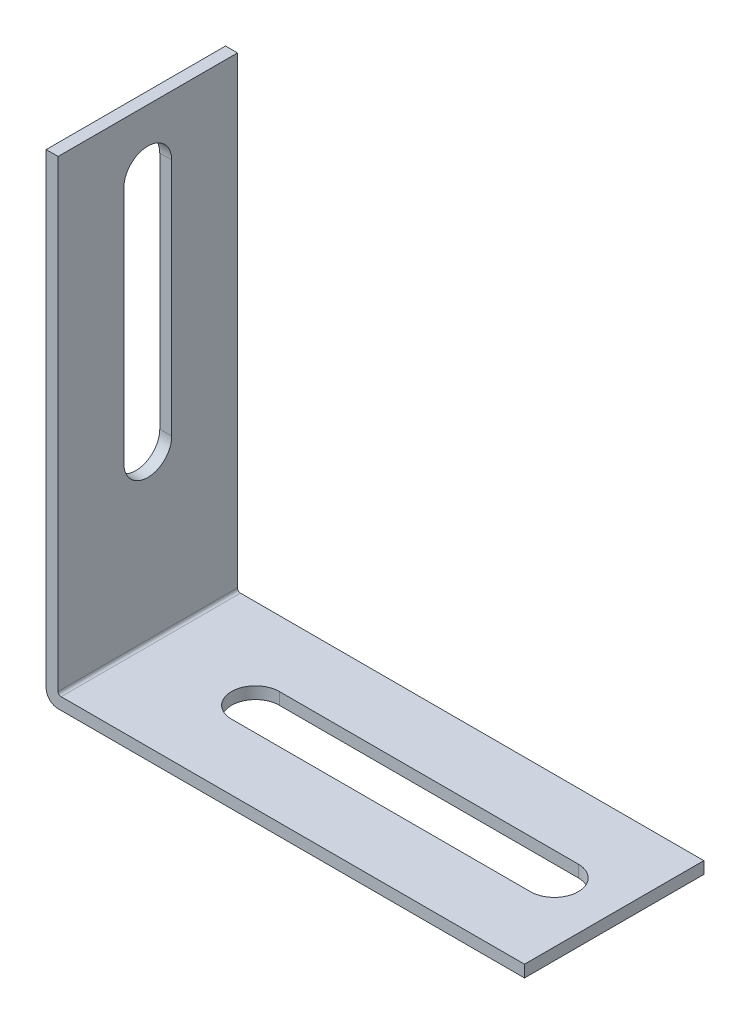
ISO-10303-21;
HEADER;
FILE_DESCRIPTION(('STEP AP214'),'2;1');
FILE_NAME('part.step','',(''),(''),'','','');
FILE_SCHEMA(('AUTOMOTIVE_DESIGN { 1 0 10303 214 1 1 1 1 }'));
ENDSEC;
DATA;
#1=APPLICATION_CONTEXT('core data for automotive mechanical design processes');
#2=APPLICATION_PROTOCOL_DEFINITION('international standard','automotive_design',2000,#1);
#3=PRODUCT_CONTEXT('',#1,'mechanical');
#4=PRODUCT('Part','Part','',(#3));
#5=PRODUCT_RELATED_PRODUCT_CATEGORY('part','',(#4));
#6=PRODUCT_DEFINITION_FORMATION('','',#4);
#7=PRODUCT_DEFINITION_CONTEXT('part definition',#1,'design');
#8=PRODUCT_DEFINITION('design','',#6,#7);
#9=PRODUCT_DEFINITION_SHAPE('','',#8);
#10=(LENGTH_UNIT() NAMED_UNIT(*) SI_UNIT(.MILLI.,.METRE.));
#11=(NAMED_UNIT(*) PLANE_ANGLE_UNIT() SI_UNIT($,.RADIAN.));
#12=(NAMED_UNIT(*) SI_UNIT($,.STERADIAN.) SOLID_ANGLE_UNIT());
#13=UNCERTAINTY_MEASURE_WITH_UNIT(LENGTH_MEASURE(1.E-05),#10,'distance_accuracy_value','');
#14=(GEOMETRIC_REPRESENTATION_CONTEXT(3) GLOBAL_UNCERTAINTY_ASSIGNED_CONTEXT((#13)) GLOBAL_UNIT_ASSIGNED_CONTEXT((#10,
#11,#12)) REPRESENTATION_CONTEXT('',''));
#15=CARTESIAN_POINT('',(0.,0.,0.));
#16=DIRECTION('',(0.,0.,1.));
#17=DIRECTION('',(1.,0.,0.));
#18=AXIS2_PLACEMENT_3D('',#15,#16,#17);
#19=CARTESIAN_POINT('',(2.,80.,30.));
#20=DIRECTION('',(0.,-1.,0.));
#21=DIRECTION('',(0.,0.,-1.));
#22=AXIS2_PLACEMENT_3D('',#19,#20,#21);
#23=PLANE('',#22);
#24=DIRECTION('',(-1.,0.,0.));
#25=VECTOR('',#24,1.);
#26=CARTESIAN_POINT('',(2.,80.,0.));
#27=LINE('',#26,#25);
#28=CARTESIAN_POINT('',(2.,80.,0.));
#29=VERTEX_POINT('',#28);
#30=CARTESIAN_POINT('',(0.,80.,0.));
#31=VERTEX_POINT('',#30);
#32=EDGE_CURVE('E214',#29,#31,#27,.T.);
#33=ORIENTED_EDGE('',*,*,#32,.T.);
#34=DIRECTION('',(0.,0.,-1.));
#35=VECTOR('',#34,1.);
#36=CARTESIAN_POINT('',(0.,80.,30.));
#37=LINE('',#36,#35);
#38=CARTESIAN_POINT('',(0.,80.,30.));
#39=VERTEX_POINT('',#38);
#40=EDGE_CURVE('E11',#39,#31,#37,.T.);
#41=ORIENTED_EDGE('',*,*,#40,.F.);
#42=DIRECTION('',(-1.,0.,0.));
#43=VECTOR('',#42,1.);
#44=CARTESIAN_POINT('',(2.,80.,30.));
#45=LINE('',#44,#43);
#46=CARTESIAN_POINT('',(2.,80.,30.));
#47=VERTEX_POINT('',#46);
#48=EDGE_CURVE('E215',#47,#39,#45,.T.);
#49=ORIENTED_EDGE('',*,*,#48,.F.);
#50=DIRECTION('',(0.,0.,-1.));
#51=VECTOR('',#50,1.);
#52=CARTESIAN_POINT('',(2.,80.,30.));
#53=LINE('',#52,#51);
#54=EDGE_CURVE('E233',#47,#29,#53,.T.);
#55=ORIENTED_EDGE('',*,*,#54,.T.);
#56=EDGE_LOOP('',(#33,#41,#49,#55));
#57=FACE_BOUND('',#56,.T.);
#58=ADVANCED_FACE('F35',(#57),#23,.F.);
#59=CARTESIAN_POINT('',(0.,80.,30.));
#60=DIRECTION('',(1.,0.,0.));
#61=DIRECTION('',(0.,1.,0.));
#62=AXIS2_PLACEMENT_3D('',#59,#60,#61);
#63=PLANE('',#62);
#64=DIRECTION('',(0.,-1.,0.));
#65=VECTOR('',#64,1.);
#66=CARTESIAN_POINT('',(0.,70.,11.));
#67=LINE('',#66,#65);
#68=CARTESIAN_POINT('',(0.,70.,11.));
#69=VERTEX_POINT('',#68);
#70=CARTESIAN_POINT('',(0.,30.,11.));
#71=VERTEX_POINT('',#70);
#72=EDGE_CURVE('E167',#69,#71,#67,.T.);
#73=ORIENTED_EDGE('',*,*,#72,.F.);
#74=CARTESIAN_POINT('',(0.,70.,15.));
#75=DIRECTION('',(1.,0.,0.));
#76=DIRECTION('',(0.,1.,0.));
#77=AXIS2_PLACEMENT_3D('',#74,#75,#76);
#78=CIRCLE('',#77,4.);
#79=CARTESIAN_POINT('',(0.,70.,19.));
#80=VERTEX_POINT('',#79);
#81=EDGE_CURVE('E149',#80,#69,#78,.F.);
#82=ORIENTED_EDGE('',*,*,#81,.F.);
#83=DIRECTION('',(0.,1.,0.));
#84=VECTOR('',#83,1.);
#85=CARTESIAN_POINT('',(0.,70.,19.));
#86=LINE('',#85,#84);
#87=CARTESIAN_POINT('',(0.,30.,19.));
#88=VERTEX_POINT('',#87);
#89=EDGE_CURVE('E158',#88,#80,#86,.T.);
#90=ORIENTED_EDGE('',*,*,#89,.F.);
#91=CARTESIAN_POINT('',(0.,30.,15.));
#92=DIRECTION('',(1.,0.,0.));
#93=DIRECTION('',(0.,1.,0.));
#94=AXIS2_PLACEMENT_3D('',#91,#92,#93);
#95=CIRCLE('',#94,4.);
#96=EDGE_CURVE('E49',#71,#88,#95,.F.);
#97=ORIENTED_EDGE('',*,*,#96,.F.);
#98=EDGE_LOOP('',(#73,#82,#90,#97));
#99=FACE_BOUND('',#98,.T.);
#100=DIRECTION('',(0.,-1.,0.));
#101=VECTOR('',#100,1.);
#102=CARTESIAN_POINT('',(0.,80.,0.));
#103=LINE('',#102,#101);
#104=CARTESIAN_POINT('',(0.,2.00000000000001,0.));
#105=VERTEX_POINT('',#104);
#106=EDGE_CURVE('E236',#31,#105,#103,.T.);
#107=ORIENTED_EDGE('',*,*,#106,.T.);
#108=DIRECTION('',(0.,0.,-1.));
#109=VECTOR('',#108,1.);
#110=CARTESIAN_POINT('',(0.,2.00000000000001,30.));
#111=LINE('',#110,#109);
#112=CARTESIAN_POINT('',(0.,2.00000000000001,30.));
#113=VERTEX_POINT('',#112);
#114=EDGE_CURVE('E42',#113,#105,#111,.T.);
#115=ORIENTED_EDGE('',*,*,#114,.F.);
#116=DIRECTION('',(0.,-1.,0.));
#117=VECTOR('',#116,1.);
#118=CARTESIAN_POINT('',(0.,80.,30.));
#119=LINE('',#118,#117);
#120=EDGE_CURVE('E218',#39,#113,#119,.T.);
#121=ORIENTED_EDGE('',*,*,#120,.F.);
#122=ORIENTED_EDGE('',*,*,#40,.T.);
#123=EDGE_LOOP('',(#107,#115,#121,#122));
#124=FACE_BOUND('',#123,.T.);
#125=ADVANCED_FACE('F164',(#99,#124),#63,.F.);
#126=CARTESIAN_POINT('',(2.,2.,30.));
#127=DIRECTION('',(0.,0.,-1.));
#128=DIRECTION('',(-1.,0.,0.));
#129=AXIS2_PLACEMENT_3D('',#126,#127,#128);
#130=CYLINDRICAL_SURFACE('',#129,2.);
#131=CARTESIAN_POINT('',(2.,2.,0.));
#132=DIRECTION('',(0.,0.,1.));
#133=DIRECTION('',(1.,0.,0.));
#134=AXIS2_PLACEMENT_3D('',#131,#132,#133);
#135=CIRCLE('',#134,2.);
#136=CARTESIAN_POINT('',(2.00000000000001,0.,0.));
#137=VERTEX_POINT('',#136);
#138=EDGE_CURVE('E238',#105,#137,#135,.T.);
#139=ORIENTED_EDGE('',*,*,#138,.T.);
#140=DIRECTION('',(0.,0.,-1.));
#141=VECTOR('',#140,1.);
#142=CARTESIAN_POINT('',(2.00000000000001,0.,30.));
#143=LINE('',#142,#141);
#144=CARTESIAN_POINT('',(2.00000000000001,0.,30.));
#145=VERTEX_POINT('',#144);
#146=EDGE_CURVE('E263',#145,#137,#143,.T.);
#147=ORIENTED_EDGE('',*,*,#146,.F.);
#148=CARTESIAN_POINT('',(2.,2.,30.));
#149=DIRECTION('',(0.,0.,1.));
#150=DIRECTION('',(1.,0.,0.));
#151=AXIS2_PLACEMENT_3D('',#148,#149,#150);
#152=CIRCLE('',#151,2.);
#153=EDGE_CURVE('E221',#113,#145,#152,.T.);
#154=ORIENTED_EDGE('',*,*,#153,.F.);
#155=ORIENTED_EDGE('',*,*,#114,.T.);
#156=EDGE_LOOP('',(#139,#147,#154,#155));
#157=FACE_BOUND('',#156,.T.);
#158=ADVANCED_FACE('F270',(#157),#130,.T.);
#159=CARTESIAN_POINT('',(2.00000000000001,0.,30.));
#160=DIRECTION('',(0.,1.,0.));
#161=DIRECTION('',(0.,0.,1.));
#162=AXIS2_PLACEMENT_3D('',#159,#160,#161);
#163=PLANE('',#162);
#164=DIRECTION('',(-1.,0.,0.));
#165=VECTOR('',#164,1.);
#166=CARTESIAN_POINT('',(70.,0.,19.));
#167=LINE('',#166,#165);
#168=CARTESIAN_POINT('',(70.,0.,19.));
#169=VERTEX_POINT('',#168);
#170=CARTESIAN_POINT('',(20.,0.,19.));
#171=VERTEX_POINT('',#170);
#172=EDGE_CURVE('E185',#169,#171,#167,.T.);
#173=ORIENTED_EDGE('',*,*,#172,.F.);
#174=CARTESIAN_POINT('',(70.,0.,15.));
#175=DIRECTION('',(0.,1.,0.));
#176=DIRECTION('',(0.,0.,1.));
#177=AXIS2_PLACEMENT_3D('',#174,#175,#176);
#178=CIRCLE('',#177,4.);
#179=CARTESIAN_POINT('',(70.,0.,11.));
#180=VERTEX_POINT('',#179);
#181=EDGE_CURVE('E188',#180,#169,#178,.F.);
#182=ORIENTED_EDGE('',*,*,#181,.F.);
#183=DIRECTION('',(1.,0.,0.));
#184=VECTOR('',#183,1.);
#185=CARTESIAN_POINT('',(70.,0.,11.));
#186=LINE('',#185,#184);
#187=CARTESIAN_POINT('',(20.,0.,11.));
#188=VERTEX_POINT('',#187);
#189=EDGE_CURVE('E205',#188,#180,#186,.T.);
#190=ORIENTED_EDGE('',*,*,#189,.F.);
#191=CARTESIAN_POINT('',(20.,0.,15.));
#192=DIRECTION('',(0.,1.,0.));
#193=DIRECTION('',(0.,0.,1.));
#194=AXIS2_PLACEMENT_3D('',#191,#192,#193);
#195=CIRCLE('',#194,4.);
#196=EDGE_CURVE('E161',#171,#188,#195,.F.);
#197=ORIENTED_EDGE('',*,*,#196,.F.);
#198=EDGE_LOOP('',(#173,#182,#190,#197));
#199=FACE_BOUND('',#198,.T.);
#200=DIRECTION('',(1.,0.,0.));
#201=VECTOR('',#200,1.);
#202=CARTESIAN_POINT('',(2.00000000000001,0.,0.));
#203=LINE('',#202,#201);
#204=CARTESIAN_POINT('',(80.,0.,0.));
#205=VERTEX_POINT('',#204);
#206=EDGE_CURVE('E240',#137,#205,#203,.T.);
#207=ORIENTED_EDGE('',*,*,#206,.T.);
#208=DIRECTION('',(0.,0.,-1.));
#209=VECTOR('',#208,1.);
#210=CARTESIAN_POINT('',(80.,0.,30.));
#211=LINE('',#210,#209);
#212=CARTESIAN_POINT('',(80.,0.,30.));
#213=VERTEX_POINT('',#212);
#214=EDGE_CURVE('E260',#213,#205,#211,.T.);
#215=ORIENTED_EDGE('',*,*,#214,.F.);
#216=DIRECTION('',(1.,0.,0.));
#217=VECTOR('',#216,1.);
#218=CARTESIAN_POINT('',(2.00000000000001,0.,30.));
#219=LINE('',#218,#217);
#220=EDGE_CURVE('E223',#145,#213,#219,.T.);
#221=ORIENTED_EDGE('',*,*,#220,.F.);
#222=ORIENTED_EDGE('',*,*,#146,.T.);
#223=EDGE_LOOP('',(#207,#215,#221,#222));
#224=FACE_BOUND('',#223,.T.);
#225=ADVANCED_FACE('F280',(#199,#224),#163,.F.);
#226=CARTESIAN_POINT('',(80.,0.,30.));
#227=DIRECTION('',(-1.,0.,0.));
#228=DIRECTION('',(0.,0.,1.));
#229=AXIS2_PLACEMENT_3D('',#226,#227,#228);
#230=PLANE('',#229);
#231=DIRECTION('',(0.,1.,0.));
#232=VECTOR('',#231,1.);
#233=CARTESIAN_POINT('',(80.,0.,0.));
#234=LINE('',#233,#232);
#235=CARTESIAN_POINT('',(80.,2.,0.));
#236=VERTEX_POINT('',#235);
#237=EDGE_CURVE('E242',#205,#236,#234,.T.);
#238=ORIENTED_EDGE('',*,*,#237,.T.);
#239=DIRECTION('',(0.,0.,-1.));
#240=VECTOR('',#239,1.);
#241=CARTESIAN_POINT('',(80.,2.,30.));
#242=LINE('',#241,#240);
#243=CARTESIAN_POINT('',(80.,2.,30.));
#244=VERTEX_POINT('',#243);
#245=EDGE_CURVE('E257',#244,#236,#242,.T.);
#246=ORIENTED_EDGE('',*,*,#245,.F.);
#247=DIRECTION('',(0.,1.,0.));
#248=VECTOR('',#247,1.);
#249=CARTESIAN_POINT('',(80.,0.,30.));
#250=LINE('',#249,#248);
#251=EDGE_CURVE('E225',#213,#244,#250,.T.);
#252=ORIENTED_EDGE('',*,*,#251,.F.);
#253=ORIENTED_EDGE('',*,*,#214,.T.);
#254=EDGE_LOOP('',(#238,#246,#252,#253));
#255=FACE_BOUND('',#254,.T.);
#256=ADVANCED_FACE('F284',(#255),#230,.F.);
#257=CARTESIAN_POINT('',(80.,2.,30.));
#258=DIRECTION('',(0.,-1.,0.));
#259=DIRECTION('',(1.,0.,0.));
#260=AXIS2_PLACEMENT_3D('',#257,#258,#259);
#261=PLANE('',#260);
#262=DIRECTION('',(-1.,0.,0.));
#263=VECTOR('',#262,1.);
#264=CARTESIAN_POINT('',(70.,2.,11.));
#265=LINE('',#264,#263);
#266=CARTESIAN_POINT('',(70.,2.,11.));
#267=VERTEX_POINT('',#266);
#268=CARTESIAN_POINT('',(20.,1.99999999999999,11.));
#269=VERTEX_POINT('',#268);
#270=EDGE_CURVE('E193',#267,#269,#265,.T.);
#271=ORIENTED_EDGE('',*,*,#270,.F.);
#272=CARTESIAN_POINT('',(70.,2.,15.));
#273=DIRECTION('',(0.,1.,0.));
#274=DIRECTION('',(-1.,0.,0.));
#275=AXIS2_PLACEMENT_3D('',#272,#273,#274);
#276=CIRCLE('',#275,4.);
#277=CARTESIAN_POINT('',(70.,2.,19.));
#278=VERTEX_POINT('',#277);
#279=EDGE_CURVE('E191',#278,#267,#276,.T.);
#280=ORIENTED_EDGE('',*,*,#279,.F.);
#281=DIRECTION('',(1.,0.,0.));
#282=VECTOR('',#281,1.);
#283=CARTESIAN_POINT('',(70.,2.,19.));
#284=LINE('',#283,#282);
#285=CARTESIAN_POINT('',(20.,1.99999999999999,19.));
#286=VERTEX_POINT('',#285);
#287=EDGE_CURVE('E199',#286,#278,#284,.T.);
#288=ORIENTED_EDGE('',*,*,#287,.F.);
#289=CARTESIAN_POINT('',(20.,1.99999999999999,15.));
#290=DIRECTION('',(0.,1.,0.));
#291=DIRECTION('',(-1.,0.,0.));
#292=AXIS2_PLACEMENT_3D('',#289,#290,#291);
#293=CIRCLE('',#292,4.);
#294=EDGE_CURVE('E196',#269,#286,#293,.T.);
#295=ORIENTED_EDGE('',*,*,#294,.F.);
#296=EDGE_LOOP('',(#271,#280,#288,#295));
#297=FACE_BOUND('',#296,.T.);
#298=DIRECTION('',(-1.,0.,0.));
#299=VECTOR('',#298,1.);
#300=CARTESIAN_POINT('',(80.,2.,0.));
#301=LINE('',#300,#299);
#302=CARTESIAN_POINT('',(2.50000000000001,1.99999999999999,0.));
#303=VERTEX_POINT('',#302);
#304=EDGE_CURVE('E244',#236,#303,#301,.T.);
#305=ORIENTED_EDGE('',*,*,#304,.T.);
#306=DIRECTION('',(0.,0.,-1.));
#307=VECTOR('',#306,1.);
#308=CARTESIAN_POINT('',(2.50000000000001,1.99999999999999,30.));
#309=LINE('',#308,#307);
#310=CARTESIAN_POINT('',(2.50000000000001,1.99999999999999,30.));
#311=VERTEX_POINT('',#310);
#312=EDGE_CURVE('E254',#311,#303,#309,.T.);
#313=ORIENTED_EDGE('',*,*,#312,.F.);
#314=DIRECTION('',(-1.,0.,0.));
#315=VECTOR('',#314,1.);
#316=CARTESIAN_POINT('',(80.,2.,30.));
#317=LINE('',#316,#315);
#318=EDGE_CURVE('E227',#244,#311,#317,.T.);
#319=ORIENTED_EDGE('',*,*,#318,.F.);
#320=ORIENTED_EDGE('',*,*,#245,.T.);
#321=EDGE_LOOP('',(#305,#313,#319,#320));
#322=FACE_BOUND('',#321,.T.);
#323=ADVANCED_FACE('F304',(#297,#322),#261,.F.);
#324=CARTESIAN_POINT('',(2.5,2.49999999999999,30.));
#325=DIRECTION('',(0.,0.,-1.));
#326=DIRECTION('',(-1.,0.,0.));
#327=AXIS2_PLACEMENT_3D('',#324,#325,#326);
#328=CYLINDRICAL_SURFACE('',#327,0.5);
#329=CARTESIAN_POINT('',(2.5,2.49999999999999,0.));
#330=DIRECTION('',(0.,0.,-1.));
#331=DIRECTION('',(1.,0.,0.));
#332=AXIS2_PLACEMENT_3D('',#329,#330,#331);
#333=CIRCLE('',#332,0.5);
#334=CARTESIAN_POINT('',(2.,2.49999999999999,0.));
#335=VERTEX_POINT('',#334);
#336=EDGE_CURVE('E246',#303,#335,#333,.T.);
#337=ORIENTED_EDGE('',*,*,#336,.T.);
#338=DIRECTION('',(0.,0.,-1.));
#339=VECTOR('',#338,1.);
#340=CARTESIAN_POINT('',(2.,2.49999999999999,30.));
#341=LINE('',#340,#339);
#342=CARTESIAN_POINT('',(2.,2.49999999999999,30.));
#343=VERTEX_POINT('',#342);
#344=EDGE_CURVE('E251',#343,#335,#341,.T.);
#345=ORIENTED_EDGE('',*,*,#344,.F.);
#346=CARTESIAN_POINT('',(2.5,2.49999999999999,30.));
#347=DIRECTION('',(0.,0.,-1.));
#348=DIRECTION('',(1.,0.,0.));
#349=AXIS2_PLACEMENT_3D('',#346,#347,#348);
#350=CIRCLE('',#349,0.5);
#351=EDGE_CURVE('E229',#311,#343,#350,.T.);
#352=ORIENTED_EDGE('',*,*,#351,.F.);
#353=ORIENTED_EDGE('',*,*,#312,.T.);
#354=EDGE_LOOP('',(#337,#345,#352,#353));
#355=FACE_BOUND('',#354,.T.);
#356=ADVANCED_FACE('F302',(#355),#328,.F.);
#357=CARTESIAN_POINT('',(2.,2.49999999999999,30.));
#358=DIRECTION('',(-1.,0.,0.));
#359=DIRECTION('',(0.,-1.,0.));
#360=AXIS2_PLACEMENT_3D('',#357,#358,#359);
#361=PLANE('',#360);
#362=DIRECTION('',(0.,-1.,0.));
#363=VECTOR('',#362,1.);
#364=CARTESIAN_POINT('',(2.,70.,19.));
#365=LINE('',#364,#363);
#366=CARTESIAN_POINT('',(2.,70.,19.));
#367=VERTEX_POINT('',#366);
#368=CARTESIAN_POINT('',(2.,30.,19.));
#369=VERTEX_POINT('',#368);
#370=EDGE_CURVE('E169',#367,#369,#365,.T.);
#371=ORIENTED_EDGE('',*,*,#370,.F.);
#372=CARTESIAN_POINT('',(2.,70.,15.));
#373=DIRECTION('',(1.,0.,0.));
#374=DIRECTION('',(0.,1.,0.));
#375=AXIS2_PLACEMENT_3D('',#372,#373,#374);
#376=CIRCLE('',#375,4.);
#377=CARTESIAN_POINT('',(2.,70.,11.));
#378=VERTEX_POINT('',#377);
#379=EDGE_CURVE('E57',#378,#367,#376,.T.);
#380=ORIENTED_EDGE('',*,*,#379,.F.);
#381=DIRECTION('',(0.,1.,0.));
#382=VECTOR('',#381,1.);
#383=CARTESIAN_POINT('',(2.,70.,11.));
#384=LINE('',#383,#382);
#385=CARTESIAN_POINT('',(2.,30.,11.));
#386=VERTEX_POINT('',#385);
#387=EDGE_CURVE('E155',#386,#378,#384,.T.);
#388=ORIENTED_EDGE('',*,*,#387,.F.);
#389=CARTESIAN_POINT('',(2.,30.,15.));
#390=DIRECTION('',(1.,0.,0.));
#391=DIRECTION('',(0.,1.,0.));
#392=AXIS2_PLACEMENT_3D('',#389,#390,#391);
#393=CIRCLE('',#392,4.);
#394=EDGE_CURVE('E175',#369,#386,#393,.T.);
#395=ORIENTED_EDGE('',*,*,#394,.F.);
#396=EDGE_LOOP('',(#371,#380,#388,#395));
#397=FACE_BOUND('',#396,.T.);
#398=DIRECTION('',(0.,1.,0.));
#399=VECTOR('',#398,1.);
#400=CARTESIAN_POINT('',(2.,2.49999999999999,0.));
#401=LINE('',#400,#399);
#402=EDGE_CURVE('E219',#335,#29,#401,.T.);
#403=ORIENTED_EDGE('',*,*,#402,.T.);
#404=ORIENTED_EDGE('',*,*,#54,.F.);
#405=DIRECTION('',(0.,1.,0.));
#406=VECTOR('',#405,1.);
#407=CARTESIAN_POINT('',(2.,2.49999999999999,30.));
#408=LINE('',#407,#406);
#409=EDGE_CURVE('E231',#343,#47,#408,.T.);
#410=ORIENTED_EDGE('',*,*,#409,.F.);
#411=ORIENTED_EDGE('',*,*,#344,.T.);
#412=EDGE_LOOP('',(#403,#404,#410,#411));
#413=FACE_BOUND('',#412,.T.);
#414=ADVANCED_FACE('F297',(#397,#413),#361,.F.);
#415=CARTESIAN_POINT('',(2.,2.,30.));
#416=DIRECTION('',(0.,0.,1.));
#417=DIRECTION('',(1.,0.,0.));
#418=AXIS2_PLACEMENT_3D('',#415,#416,#417);
#419=PLANE('',#418);
#420=ORIENTED_EDGE('',*,*,#48,.T.);
#421=ORIENTED_EDGE('',*,*,#120,.T.);
#422=ORIENTED_EDGE('',*,*,#153,.T.);
#423=ORIENTED_EDGE('',*,*,#220,.T.);
#424=ORIENTED_EDGE('',*,*,#251,.T.);
#425=ORIENTED_EDGE('',*,*,#318,.T.);
#426=ORIENTED_EDGE('',*,*,#351,.T.);
#427=ORIENTED_EDGE('',*,*,#409,.T.);
#428=EDGE_LOOP('',(#420,#421,#422,#423,#424,#425,#426,#427));
#429=FACE_BOUND('',#428,.T.);
#430=ADVANCED_FACE('F288',(#429),#419,.T.);
#431=CARTESIAN_POINT('',(2.,2.,0.));
#432=DIRECTION('',(0.,0.,1.));
#433=DIRECTION('',(1.,0.,0.));
#434=AXIS2_PLACEMENT_3D('',#431,#432,#433);
#435=PLANE('',#434);
#436=ORIENTED_EDGE('',*,*,#32,.F.);
#437=ORIENTED_EDGE('',*,*,#402,.F.);
#438=ORIENTED_EDGE('',*,*,#336,.F.);
#439=ORIENTED_EDGE('',*,*,#304,.F.);
#440=ORIENTED_EDGE('',*,*,#237,.F.);
#441=ORIENTED_EDGE('',*,*,#206,.F.);
#442=ORIENTED_EDGE('',*,*,#138,.F.);
#443=ORIENTED_EDGE('',*,*,#106,.F.);
#444=EDGE_LOOP('',(#436,#437,#438,#439,#440,#441,#442,#443));
#445=FACE_BOUND('',#444,.T.);
#446=ADVANCED_FACE('F275',(#445),#435,.F.);
#447=CARTESIAN_POINT('',(70.,-0.00100000000000143,15.));
#448=DIRECTION('',(0.,1.,0.));
#449=DIRECTION('',(-1.,0.,0.));
#450=AXIS2_PLACEMENT_3D('',#447,#448,#449);
#451=CYLINDRICAL_SURFACE('',#450,4.);
#452=ORIENTED_EDGE('',*,*,#181,.T.);
#453=DIRECTION('',(0.,1.,0.));
#454=VECTOR('',#453,1.);
#455=CARTESIAN_POINT('',(70.,-0.00100000000000143,19.));
#456=LINE('',#455,#454);
#457=EDGE_CURVE('E203',#169,#278,#456,.T.);
#458=ORIENTED_EDGE('',*,*,#457,.T.);
#459=ORIENTED_EDGE('',*,*,#279,.T.);
#460=DIRECTION('',(0.,1.,0.));
#461=VECTOR('',#460,1.);
#462=CARTESIAN_POINT('',(70.,-0.00100000000000143,11.));
#463=LINE('',#462,#461);
#464=EDGE_CURVE('E202',#180,#267,#463,.T.);
#465=ORIENTED_EDGE('',*,*,#464,.F.);
#466=EDGE_LOOP('',(#452,#458,#459,#465));
#467=FACE_BOUND('',#466,.T.);
#468=ADVANCED_FACE('F337',(#467),#451,.F.);
#469=CARTESIAN_POINT('',(70.,-0.00100000000000143,19.));
#470=DIRECTION('',(0.,0.,1.));
#471=DIRECTION('',(1.,0.,0.));
#472=AXIS2_PLACEMENT_3D('',#469,#470,#471);
#473=PLANE('',#472);
#474=ORIENTED_EDGE('',*,*,#172,.T.);
#475=DIRECTION('',(0.,1.,0.));
#476=VECTOR('',#475,1.);
#477=CARTESIAN_POINT('',(20.,-0.00100000000000751,19.));
#478=LINE('',#477,#476);
#479=EDGE_CURVE('E206',#171,#286,#478,.T.);
#480=ORIENTED_EDGE('',*,*,#479,.T.);
#481=ORIENTED_EDGE('',*,*,#287,.T.);
#482=ORIENTED_EDGE('',*,*,#457,.F.);
#483=EDGE_LOOP('',(#474,#480,#481,#482));
#484=FACE_BOUND('',#483,.T.);
#485=ADVANCED_FACE('F333',(#484),#473,.F.);
#486=CARTESIAN_POINT('',(20.,-0.00100000000000751,15.));
#487=DIRECTION('',(0.,1.,0.));
#488=DIRECTION('',(-1.,0.,0.));
#489=AXIS2_PLACEMENT_3D('',#486,#487,#488);
#490=CYLINDRICAL_SURFACE('',#489,4.);
#491=ORIENTED_EDGE('',*,*,#196,.T.);
#492=DIRECTION('',(0.,1.,0.));
#493=VECTOR('',#492,1.);
#494=CARTESIAN_POINT('',(20.,-0.00100000000000751,11.));
#495=LINE('',#494,#493);
#496=EDGE_CURVE('E208',#188,#269,#495,.T.);
#497=ORIENTED_EDGE('',*,*,#496,.T.);
#498=ORIENTED_EDGE('',*,*,#294,.T.);
#499=ORIENTED_EDGE('',*,*,#479,.F.);
#500=EDGE_LOOP('',(#491,#497,#498,#499));
#501=FACE_BOUND('',#500,.T.);
#502=ADVANCED_FACE('F343',(#501),#490,.F.);
#503=CARTESIAN_POINT('',(70.,-0.00100000000000143,11.));
#504=DIRECTION('',(0.,0.,-1.));
#505=DIRECTION('',(-1.,0.,0.));
#506=AXIS2_PLACEMENT_3D('',#503,#504,#505);
#507=PLANE('',#506);
#508=ORIENTED_EDGE('',*,*,#189,.T.);
#509=ORIENTED_EDGE('',*,*,#464,.T.);
#510=ORIENTED_EDGE('',*,*,#270,.T.);
#511=ORIENTED_EDGE('',*,*,#496,.F.);
#512=EDGE_LOOP('',(#508,#509,#510,#511));
#513=FACE_BOUND('',#512,.T.);
#514=ADVANCED_FACE('F340',(#513),#507,.F.);
#515=CARTESIAN_POINT('',(-0.00100000000000143,70.,15.));
#516=DIRECTION('',(1.,0.,0.));
#517=DIRECTION('',(0.,1.,0.));
#518=AXIS2_PLACEMENT_3D('',#515,#516,#517);
#519=CYLINDRICAL_SURFACE('',#518,4.);
#520=ORIENTED_EDGE('',*,*,#81,.T.);
#521=DIRECTION('',(1.,0.,0.));
#522=VECTOR('',#521,1.);
#523=CARTESIAN_POINT('',(-0.00100000000000143,70.,11.));
#524=LINE('',#523,#522);
#525=EDGE_CURVE('E162',#69,#378,#524,.T.);
#526=ORIENTED_EDGE('',*,*,#525,.T.);
#527=ORIENTED_EDGE('',*,*,#379,.T.);
#528=DIRECTION('',(1.,0.,0.));
#529=VECTOR('',#528,1.);
#530=CARTESIAN_POINT('',(-0.00100000000000143,70.,19.));
#531=LINE('',#530,#529);
#532=EDGE_CURVE('E145',#80,#367,#531,.T.);
#533=ORIENTED_EDGE('',*,*,#532,.F.);
#534=EDGE_LOOP('',(#520,#526,#527,#533));
#535=FACE_BOUND('',#534,.T.);
#536=ADVANCED_FACE('F147',(#535),#519,.F.);
#537=CARTESIAN_POINT('',(-0.00100000000000143,70.,11.));
#538=DIRECTION('',(0.,0.,-1.));
#539=DIRECTION('',(0.,1.,0.));
#540=AXIS2_PLACEMENT_3D('',#537,#538,#539);
#541=PLANE('',#540);
#542=ORIENTED_EDGE('',*,*,#72,.T.);
#543=DIRECTION('',(1.,0.,0.));
#544=VECTOR('',#543,1.);
#545=CARTESIAN_POINT('',(-0.00100000000000057,30.,11.));
#546=LINE('',#545,#544);
#547=EDGE_CURVE('E181',#71,#386,#546,.T.);
#548=ORIENTED_EDGE('',*,*,#547,.T.);
#549=ORIENTED_EDGE('',*,*,#387,.T.);
#550=ORIENTED_EDGE('',*,*,#525,.F.);
#551=EDGE_LOOP('',(#542,#548,#549,#550));
#552=FACE_BOUND('',#551,.T.);
#553=ADVANCED_FACE('F368',(#552),#541,.F.);
#554=CARTESIAN_POINT('',(-0.00100000000000057,30.,15.));
#555=DIRECTION('',(1.,0.,0.));
#556=DIRECTION('',(0.,1.,0.));
#557=AXIS2_PLACEMENT_3D('',#554,#555,#556);
#558=CYLINDRICAL_SURFACE('',#557,4.);
#559=ORIENTED_EDGE('',*,*,#96,.T.);
#560=DIRECTION('',(1.,0.,0.));
#561=VECTOR('',#560,1.);
#562=CARTESIAN_POINT('',(-0.00100000000000057,30.,19.));
#563=LINE('',#562,#561);
#564=EDGE_CURVE('E154',#88,#369,#563,.T.);
#565=ORIENTED_EDGE('',*,*,#564,.T.);
#566=ORIENTED_EDGE('',*,*,#394,.T.);
#567=ORIENTED_EDGE('',*,*,#547,.F.);
#568=EDGE_LOOP('',(#559,#565,#566,#567));
#569=FACE_BOUND('',#568,.T.);
#570=ADVANCED_FACE('F366',(#569),#558,.F.);
#571=CARTESIAN_POINT('',(-0.00100000000000143,70.,19.));
#572=DIRECTION('',(0.,0.,1.));
#573=DIRECTION('',(0.,-1.,0.));
#574=AXIS2_PLACEMENT_3D('',#571,#572,#573);
#575=PLANE('',#574);
#576=ORIENTED_EDGE('',*,*,#89,.T.);
#577=ORIENTED_EDGE('',*,*,#532,.T.);
#578=ORIENTED_EDGE('',*,*,#370,.T.);
#579=ORIENTED_EDGE('',*,*,#564,.F.);
#580=EDGE_LOOP('',(#576,#577,#578,#579));
#581=FACE_BOUND('',#580,.T.);
#582=ADVANCED_FACE('F159',(#581),#575,.F.);
#583=CLOSED_SHELL('',(#58,#125,#158,#225,#256,#323,#356,#414,#430,#446,#468,#485,#502,#514,#536,
#553,#570,#582));
#584=MANIFOLD_SOLID_BREP('B2',#583);
#585=ADVANCED_BREP_SHAPE_REPRESENTATION('',(#18,#584),#14);
#586=SHAPE_DEFINITION_REPRESENTATION(#9,#585);
ENDSEC;
END-ISO-10303-21;
